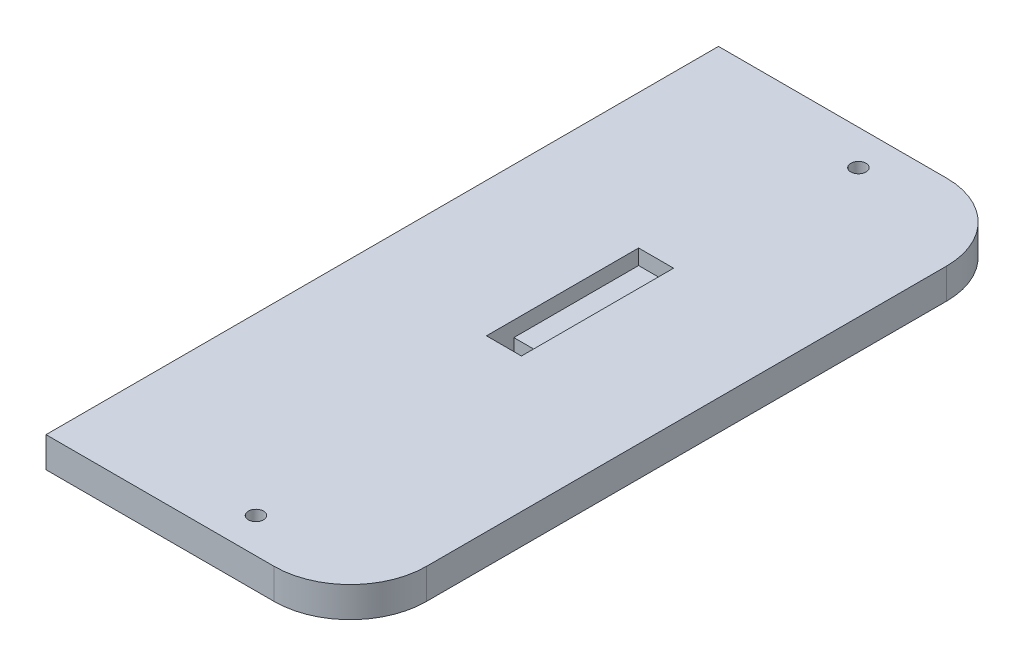
ISO-10303-21;
HEADER;
FILE_DESCRIPTION(('STEP AP214'),'2;1');
FILE_NAME('part.step','',(''),(''),'','','');
FILE_SCHEMA(('AUTOMOTIVE_DESIGN { 1 0 10303 214 1 1 1 1 }'));
ENDSEC;
DATA;
#1=APPLICATION_CONTEXT('core data for automotive mechanical design processes');
#2=APPLICATION_PROTOCOL_DEFINITION('international standard','automotive_design',2000,#1);
#3=PRODUCT_CONTEXT('',#1,'mechanical');
#4=PRODUCT('Part','Part','',(#3));
#5=PRODUCT_RELATED_PRODUCT_CATEGORY('part','',(#4));
#6=PRODUCT_DEFINITION_FORMATION('','',#4);
#7=PRODUCT_DEFINITION_CONTEXT('part definition',#1,'design');
#8=PRODUCT_DEFINITION('design','',#6,#7);
#9=PRODUCT_DEFINITION_SHAPE('','',#8);
#10=(LENGTH_UNIT() NAMED_UNIT(*) SI_UNIT(.MILLI.,.METRE.));
#11=(NAMED_UNIT(*) PLANE_ANGLE_UNIT() SI_UNIT($,.RADIAN.));
#12=(NAMED_UNIT(*) SI_UNIT($,.STERADIAN.) SOLID_ANGLE_UNIT());
#13=UNCERTAINTY_MEASURE_WITH_UNIT(LENGTH_MEASURE(1.E-05),#10,'distance_accuracy_value','');
#14=(GEOMETRIC_REPRESENTATION_CONTEXT(3) GLOBAL_UNCERTAINTY_ASSIGNED_CONTEXT((#13)) GLOBAL_UNIT_ASSIGNED_CONTEXT((#10,
#11,#12)) REPRESENTATION_CONTEXT('',''));
#15=CARTESIAN_POINT('',(0.,0.,0.));
#16=DIRECTION('',(0.,0.,1.));
#17=DIRECTION('',(1.,0.,0.));
#18=AXIS2_PLACEMENT_3D('',#15,#16,#17);
#19=CARTESIAN_POINT('',(0.,2.,0.));
#20=DIRECTION('',(0.,-1.,0.));
#21=DIRECTION('',(0.,0.,-1.));
#22=AXIS2_PLACEMENT_3D('',#19,#20,#21);
#23=PLANE('',#22);
#24=DIRECTION('',(-1.,0.,0.));
#25=VECTOR('',#24,1.);
#26=CARTESIAN_POINT('',(17.7,2.,-43.8));
#27=LINE('',#26,#25);
#28=CARTESIAN_POINT('',(22.3,2.,-43.8));
#29=VERTEX_POINT('',#28);
#30=CARTESIAN_POINT('',(17.7,2.,-43.8));
#31=VERTEX_POINT('',#30);
#32=EDGE_CURVE('E139',#29,#31,#27,.T.);
#33=ORIENTED_EDGE('',*,*,#32,.F.);
#34=DIRECTION('',(0.,0.,1.));
#35=VECTOR('',#34,1.);
#36=CARTESIAN_POINT('',(22.3,2.,-40.2));
#37=LINE('',#36,#35);
#38=CARTESIAN_POINT('',(22.3,2.,-60.2));
#39=VERTEX_POINT('',#38);
#40=EDGE_CURVE('E152',#39,#29,#37,.T.);
#41=ORIENTED_EDGE('',*,*,#40,.F.);
#42=DIRECTION('',(1.,0.,0.));
#43=VECTOR('',#42,1.);
#44=CARTESIAN_POINT('',(17.7,2.,-60.2));
#45=LINE('',#44,#43);
#46=CARTESIAN_POINT('',(17.7,2.,-60.2));
#47=VERTEX_POINT('',#46);
#48=EDGE_CURVE('E148',#47,#39,#45,.T.);
#49=ORIENTED_EDGE('',*,*,#48,.F.);
#50=DIRECTION('',(0.,0.,-1.));
#51=VECTOR('',#50,1.);
#52=CARTESIAN_POINT('',(17.7,2.,-40.2));
#53=LINE('',#52,#51);
#54=EDGE_CURVE('E133',#31,#47,#53,.T.);
#55=ORIENTED_EDGE('',*,*,#54,.F.);
#56=EDGE_LOOP('',(#33,#41,#49,#55));
#57=FACE_BOUND('',#56,.T.);
#58=ADVANCED_FACE('F39',(#57),#23,.F.);
#59=CARTESIAN_POINT('',(23.,10.,-83.8));
#60=DIRECTION('',(0.,-1.,0.));
#61=DIRECTION('',(0.,0.,-1.));
#62=AXIS2_PLACEMENT_3D('',#59,#60,#61);
#63=CYLINDRICAL_SURFACE('',#62,1.);
#64=CARTESIAN_POINT('',(23.,4.,-83.8));
#65=DIRECTION('',(0.,-1.,0.));
#66=DIRECTION('',(0.,0.,-1.));
#67=AXIS2_PLACEMENT_3D('',#64,#65,#66);
#68=CIRCLE('',#67,1.);
#69=CARTESIAN_POINT('',(23.,4.,-84.8));
#70=VERTEX_POINT('',#69);
#71=EDGE_CURVE('E186',#70,#70,#68,.T.);
#72=ORIENTED_EDGE('',*,*,#71,.F.);
#73=EDGE_LOOP('',(#72));
#74=FACE_BOUND('',#73,.T.);
#75=CARTESIAN_POINT('',(23.,2.5,-83.8));
#76=DIRECTION('',(0.,-1.,0.));
#77=DIRECTION('',(0.,0.,-1.));
#78=AXIS2_PLACEMENT_3D('',#75,#76,#77);
#79=CIRCLE('',#78,1.);
#80=CARTESIAN_POINT('',(23.,2.5,-84.8));
#81=VERTEX_POINT('',#80);
#82=EDGE_CURVE('E191',#81,#81,#79,.F.);
#83=ORIENTED_EDGE('',*,*,#82,.F.);
#84=EDGE_LOOP('',(#83));
#85=FACE_BOUND('',#84,.T.);
#86=ADVANCED_FACE('F313',(#74,#85),#63,.F.);
#87=CARTESIAN_POINT('',(23.,10.,-4.6));
#88=DIRECTION('',(0.,-1.,0.));
#89=DIRECTION('',(0.,0.,-1.));
#90=AXIS2_PLACEMENT_3D('',#87,#88,#89);
#91=CYLINDRICAL_SURFACE('',#90,1.);
#92=CARTESIAN_POINT('',(23.,4.,-4.6));
#93=DIRECTION('',(0.,-1.,0.));
#94=DIRECTION('',(0.,0.,-1.));
#95=AXIS2_PLACEMENT_3D('',#92,#93,#94);
#96=CIRCLE('',#95,1.);
#97=CARTESIAN_POINT('',(23.,4.,-5.6));
#98=VERTEX_POINT('',#97);
#99=EDGE_CURVE('E190',#98,#98,#96,.T.);
#100=ORIENTED_EDGE('',*,*,#99,.F.);
#101=EDGE_LOOP('',(#100));
#102=FACE_BOUND('',#101,.T.);
#103=CARTESIAN_POINT('',(23.,2.5,-4.6));
#104=DIRECTION('',(0.,-1.,0.));
#105=DIRECTION('',(0.,0.,-1.));
#106=AXIS2_PLACEMENT_3D('',#103,#104,#105);
#107=CIRCLE('',#106,1.);
#108=CARTESIAN_POINT('',(23.,2.5,-5.6));
#109=VERTEX_POINT('',#108);
#110=EDGE_CURVE('E174',#109,#109,#107,.F.);
#111=ORIENTED_EDGE('',*,*,#110,.F.);
#112=EDGE_LOOP('',(#111));
#113=FACE_BOUND('',#112,.T.);
#114=ADVANCED_FACE('F318',(#102,#113),#91,.F.);
#115=CARTESIAN_POINT('',(0.,4.,0.));
#116=DIRECTION('',(1.,0.,0.));
#117=DIRECTION('',(0.,0.,-1.));
#118=AXIS2_PLACEMENT_3D('',#115,#116,#117);
#119=PLANE('',#118);
#120=DIRECTION('',(0.,0.,1.));
#121=VECTOR('',#120,1.);
#122=CARTESIAN_POINT('',(0.,0.,0.));
#123=LINE('',#122,#121);
#124=CARTESIAN_POINT('',(0.,0.,-88.4));
#125=VERTEX_POINT('',#124);
#126=CARTESIAN_POINT('',(0.,0.,0.));
#127=VERTEX_POINT('',#126);
#128=EDGE_CURVE('E195',#125,#127,#123,.T.);
#129=ORIENTED_EDGE('',*,*,#128,.T.);
#130=DIRECTION('',(0.,-1.,0.));
#131=VECTOR('',#130,1.);
#132=CARTESIAN_POINT('',(0.,4.,0.));
#133=LINE('',#132,#131);
#134=CARTESIAN_POINT('',(0.,4.,0.));
#135=VERTEX_POINT('',#134);
#136=EDGE_CURVE('E229',#135,#127,#133,.T.);
#137=ORIENTED_EDGE('',*,*,#136,.F.);
#138=DIRECTION('',(0.,0.,1.));
#139=VECTOR('',#138,1.);
#140=CARTESIAN_POINT('',(0.,4.,0.));
#141=LINE('',#140,#139);
#142=CARTESIAN_POINT('',(0.,4.,-88.4));
#143=VERTEX_POINT('',#142);
#144=EDGE_CURVE('E196',#143,#135,#141,.T.);
#145=ORIENTED_EDGE('',*,*,#144,.F.);
#146=DIRECTION('',(0.,-1.,0.));
#147=VECTOR('',#146,1.);
#148=CARTESIAN_POINT('',(0.,4.,-88.4));
#149=LINE('',#148,#147);
#150=EDGE_CURVE('E212',#143,#125,#149,.T.);
#151=ORIENTED_EDGE('',*,*,#150,.T.);
#152=EDGE_LOOP('',(#129,#137,#145,#151));
#153=FACE_BOUND('',#152,.T.);
#154=ADVANCED_FACE('F346',(#153),#119,.F.);
#155=CARTESIAN_POINT('',(0.,4.,0.));
#156=DIRECTION('',(0.,0.,-1.));
#157=DIRECTION('',(-1.,0.,0.));
#158=AXIS2_PLACEMENT_3D('',#155,#156,#157);
#159=PLANE('',#158);
#160=DIRECTION('',(1.,0.,0.));
#161=VECTOR('',#160,1.);
#162=CARTESIAN_POINT('',(0.,0.,0.));
#163=LINE('',#162,#161);
#164=CARTESIAN_POINT('',(30.,0.,0.));
#165=VERTEX_POINT('',#164);
#166=EDGE_CURVE('E216',#127,#165,#163,.T.);
#167=ORIENTED_EDGE('',*,*,#166,.T.);
#168=DIRECTION('',(0.,-1.,0.));
#169=VECTOR('',#168,1.);
#170=CARTESIAN_POINT('',(30.,4.,0.));
#171=LINE('',#170,#169);
#172=CARTESIAN_POINT('',(30.,4.,0.));
#173=VERTEX_POINT('',#172);
#174=EDGE_CURVE('E256',#165,#173,#171,.F.);
#175=ORIENTED_EDGE('',*,*,#174,.T.);
#176=DIRECTION('',(1.,0.,0.));
#177=VECTOR('',#176,1.);
#178=CARTESIAN_POINT('',(0.,4.,0.));
#179=LINE('',#178,#177);
#180=EDGE_CURVE('E200',#135,#173,#179,.T.);
#181=ORIENTED_EDGE('',*,*,#180,.F.);
#182=ORIENTED_EDGE('',*,*,#136,.T.);
#183=EDGE_LOOP('',(#167,#175,#181,#182));
#184=FACE_BOUND('',#183,.T.);
#185=ADVANCED_FACE('F361',(#184),#159,.F.);
#186=CARTESIAN_POINT('',(40.,4.,0.));
#187=DIRECTION('',(-1.,0.,0.));
#188=DIRECTION('',(0.,0.,1.));
#189=AXIS2_PLACEMENT_3D('',#186,#187,#188);
#190=PLANE('',#189);
#191=DIRECTION('',(0.,0.,-1.));
#192=VECTOR('',#191,1.);
#193=CARTESIAN_POINT('',(40.,0.,0.));
#194=LINE('',#193,#192);
#195=CARTESIAN_POINT('',(40.,0.,-10.));
#196=VERTEX_POINT('',#195);
#197=CARTESIAN_POINT('',(40.,0.,-78.4));
#198=VERTEX_POINT('',#197);
#199=EDGE_CURVE('E220',#196,#198,#194,.T.);
#200=ORIENTED_EDGE('',*,*,#199,.T.);
#201=DIRECTION('',(0.,-1.,0.));
#202=VECTOR('',#201,1.);
#203=CARTESIAN_POINT('',(40.,4.,-78.4));
#204=LINE('',#203,#202);
#205=CARTESIAN_POINT('',(40.,4.,-78.4));
#206=VERTEX_POINT('',#205);
#207=EDGE_CURVE('E247',#198,#206,#204,.F.);
#208=ORIENTED_EDGE('',*,*,#207,.T.);
#209=DIRECTION('',(0.,0.,-1.));
#210=VECTOR('',#209,1.);
#211=CARTESIAN_POINT('',(40.,4.,0.));
#212=LINE('',#211,#210);
#213=CARTESIAN_POINT('',(40.,4.,-10.));
#214=VERTEX_POINT('',#213);
#215=EDGE_CURVE('E205',#214,#206,#212,.T.);
#216=ORIENTED_EDGE('',*,*,#215,.F.);
#217=DIRECTION('',(0.,-1.,0.));
#218=VECTOR('',#217,1.);
#219=CARTESIAN_POINT('',(40.,4.,-10.));
#220=LINE('',#219,#218);
#221=EDGE_CURVE('E243',#214,#196,#220,.T.);
#222=ORIENTED_EDGE('',*,*,#221,.T.);
#223=EDGE_LOOP('',(#200,#208,#216,#222));
#224=FACE_BOUND('',#223,.T.);
#225=ADVANCED_FACE('F357',(#224),#190,.F.);
#226=CARTESIAN_POINT('',(0.,4.,-88.4));
#227=DIRECTION('',(0.,0.,1.));
#228=DIRECTION('',(1.,0.,0.));
#229=AXIS2_PLACEMENT_3D('',#226,#227,#228);
#230=PLANE('',#229);
#231=DIRECTION('',(-1.,0.,0.));
#232=VECTOR('',#231,1.);
#233=CARTESIAN_POINT('',(0.,4.,-88.4));
#234=LINE('',#233,#232);
#235=CARTESIAN_POINT('',(30.,4.,-88.4));
#236=VERTEX_POINT('',#235);
#237=EDGE_CURVE('E209',#236,#143,#234,.T.);
#238=ORIENTED_EDGE('',*,*,#237,.F.);
#239=DIRECTION('',(0.,-1.,0.));
#240=VECTOR('',#239,1.);
#241=CARTESIAN_POINT('',(30.,4.,-88.4));
#242=LINE('',#241,#240);
#243=CARTESIAN_POINT('',(30.,0.,-88.4));
#244=VERTEX_POINT('',#243);
#245=EDGE_CURVE('E233',#236,#244,#242,.T.);
#246=ORIENTED_EDGE('',*,*,#245,.T.);
#247=DIRECTION('',(-1.,0.,0.));
#248=VECTOR('',#247,1.);
#249=CARTESIAN_POINT('',(0.,0.,-88.4));
#250=LINE('',#249,#248);
#251=EDGE_CURVE('E201',#244,#125,#250,.T.);
#252=ORIENTED_EDGE('',*,*,#251,.T.);
#253=ORIENTED_EDGE('',*,*,#150,.F.);
#254=EDGE_LOOP('',(#238,#246,#252,#253));
#255=FACE_BOUND('',#254,.T.);
#256=ADVANCED_FACE('F351',(#255),#230,.F.);
#257=CARTESIAN_POINT('',(0.,4.,0.));
#258=DIRECTION('',(0.,-1.,0.));
#259=DIRECTION('',(0.,0.,-1.));
#260=AXIS2_PLACEMENT_3D('',#257,#258,#259);
#261=PLANE('',#260);
#262=DIRECTION('',(-1.,0.,0.));
#263=VECTOR('',#262,1.);
#264=CARTESIAN_POINT('',(0.,4.,-40.2));
#265=LINE('',#264,#263);
#266=CARTESIAN_POINT('',(22.3,4.,-40.2));
#267=VERTEX_POINT('',#266);
#268=CARTESIAN_POINT('',(17.7,4.,-40.2));
#269=VERTEX_POINT('',#268);
#270=EDGE_CURVE('E273',#267,#269,#265,.T.);
#271=ORIENTED_EDGE('',*,*,#270,.T.);
#272=DIRECTION('',(0.,0.,-1.));
#273=VECTOR('',#272,1.);
#274=CARTESIAN_POINT('',(17.7,4.,0.));
#275=LINE('',#274,#273);
#276=CARTESIAN_POINT('',(17.7,4.,-60.2));
#277=VERTEX_POINT('',#276);
#278=EDGE_CURVE('E277',#269,#277,#275,.T.);
#279=ORIENTED_EDGE('',*,*,#278,.T.);
#280=DIRECTION('',(1.,0.,0.));
#281=VECTOR('',#280,1.);
#282=CARTESIAN_POINT('',(0.,4.,-60.2));
#283=LINE('',#282,#281);
#284=CARTESIAN_POINT('',(22.3,4.,-60.2));
#285=VERTEX_POINT('',#284);
#286=EDGE_CURVE('E259',#277,#285,#283,.T.);
#287=ORIENTED_EDGE('',*,*,#286,.T.);
#288=DIRECTION('',(0.,0.,1.));
#289=VECTOR('',#288,1.);
#290=CARTESIAN_POINT('',(22.3,4.,0.));
#291=LINE('',#290,#289);
#292=EDGE_CURVE('E269',#285,#267,#291,.T.);
#293=ORIENTED_EDGE('',*,*,#292,.T.);
#294=EDGE_LOOP('',(#271,#279,#287,#293));
#295=FACE_BOUND('',#294,.T.);
#296=ORIENTED_EDGE('',*,*,#99,.T.);
#297=EDGE_LOOP('',(#296));
#298=FACE_BOUND('',#297,.T.);
#299=ORIENTED_EDGE('',*,*,#71,.T.);
#300=EDGE_LOOP('',(#299));
#301=FACE_BOUND('',#300,.T.);
#302=ORIENTED_EDGE('',*,*,#215,.T.);
#303=CARTESIAN_POINT('',(30.,4.,-78.4));
#304=DIRECTION('',(0.,-1.,0.));
#305=DIRECTION('',(0.,0.,-1.));
#306=AXIS2_PLACEMENT_3D('',#303,#304,#305);
#307=CIRCLE('',#306,10.);
#308=EDGE_CURVE('E253',#206,#236,#307,.F.);
#309=ORIENTED_EDGE('',*,*,#308,.T.);
#310=ORIENTED_EDGE('',*,*,#237,.T.);
#311=ORIENTED_EDGE('',*,*,#144,.T.);
#312=ORIENTED_EDGE('',*,*,#180,.T.);
#313=CARTESIAN_POINT('',(30.,4.,-10.));
#314=DIRECTION('',(0.,-1.,0.));
#315=DIRECTION('',(0.,0.,-1.));
#316=AXIS2_PLACEMENT_3D('',#313,#314,#315);
#317=CIRCLE('',#316,10.);
#318=EDGE_CURVE('E250',#173,#214,#317,.F.);
#319=ORIENTED_EDGE('',*,*,#318,.T.);
#320=EDGE_LOOP('',(#302,#309,#310,#311,#312,#319));
#321=FACE_BOUND('',#320,.T.);
#322=ADVANCED_FACE('F298',(#295,#298,#301,#321),#261,.F.);
#323=CARTESIAN_POINT('',(0.,0.,0.));
#324=DIRECTION('',(0.,-1.,0.));
#325=DIRECTION('',(0.,0.,-1.));
#326=AXIS2_PLACEMENT_3D('',#323,#324,#325);
#327=PLANE('',#326);
#328=DIRECTION('',(0.,0.,-1.));
#329=VECTOR('',#328,1.);
#330=CARTESIAN_POINT('',(17.7,0.,0.));
#331=LINE('',#330,#329);
#332=CARTESIAN_POINT('',(17.7,0.,-40.2));
#333=VERTEX_POINT('',#332);
#334=CARTESIAN_POINT('',(17.7,0.,-43.8));
#335=VERTEX_POINT('',#334);
#336=EDGE_CURVE('E11',#333,#335,#331,.T.);
#337=ORIENTED_EDGE('',*,*,#336,.F.);
#338=DIRECTION('',(-1.,0.,0.));
#339=VECTOR('',#338,1.);
#340=CARTESIAN_POINT('',(0.,0.,-40.2));
#341=LINE('',#340,#339);
#342=CARTESIAN_POINT('',(22.3,0.,-40.2));
#343=VERTEX_POINT('',#342);
#344=EDGE_CURVE('E281',#343,#333,#341,.T.);
#345=ORIENTED_EDGE('',*,*,#344,.F.);
#346=DIRECTION('',(0.,0.,1.));
#347=VECTOR('',#346,1.);
#348=CARTESIAN_POINT('',(22.3,0.,0.));
#349=LINE('',#348,#347);
#350=CARTESIAN_POINT('',(22.3,0.,-43.8));
#351=VERTEX_POINT('',#350);
#352=EDGE_CURVE('E284',#351,#343,#349,.T.);
#353=ORIENTED_EDGE('',*,*,#352,.F.);
#354=DIRECTION('',(1.,0.,0.));
#355=VECTOR('',#354,1.);
#356=CARTESIAN_POINT('',(0.,0.,-43.8));
#357=LINE('',#356,#355);
#358=EDGE_CURVE('E48',#335,#351,#357,.T.);
#359=ORIENTED_EDGE('',*,*,#358,.F.);
#360=EDGE_LOOP('',(#337,#345,#353,#359));
#361=FACE_BOUND('',#360,.T.);
#362=CARTESIAN_POINT('',(23.,0.,-4.6));
#363=DIRECTION('',(0.,-1.,0.));
#364=DIRECTION('',(0.,0.,-1.));
#365=AXIS2_PLACEMENT_3D('',#362,#363,#364);
#366=CIRCLE('',#365,1.6);
#367=CARTESIAN_POINT('',(23.,0.,-6.2));
#368=VERTEX_POINT('',#367);
#369=EDGE_CURVE('E175',#368,#368,#366,.T.);
#370=ORIENTED_EDGE('',*,*,#369,.F.);
#371=EDGE_LOOP('',(#370));
#372=FACE_BOUND('',#371,.T.);
#373=CARTESIAN_POINT('',(23.,0.,-83.8));
#374=DIRECTION('',(0.,-1.,0.));
#375=DIRECTION('',(0.,0.,-1.));
#376=AXIS2_PLACEMENT_3D('',#373,#374,#375);
#377=CIRCLE('',#376,1.6);
#378=CARTESIAN_POINT('',(23.,0.,-85.4));
#379=VERTEX_POINT('',#378);
#380=EDGE_CURVE('E162',#379,#379,#377,.T.);
#381=ORIENTED_EDGE('',*,*,#380,.F.);
#382=EDGE_LOOP('',(#381));
#383=FACE_BOUND('',#382,.T.);
#384=ORIENTED_EDGE('',*,*,#251,.F.);
#385=CARTESIAN_POINT('',(30.,0.,-78.4));
#386=DIRECTION('',(0.,-1.,0.));
#387=DIRECTION('',(0.,0.,-1.));
#388=AXIS2_PLACEMENT_3D('',#385,#386,#387);
#389=CIRCLE('',#388,10.);
#390=EDGE_CURVE('E240',#244,#198,#389,.T.);
#391=ORIENTED_EDGE('',*,*,#390,.T.);
#392=ORIENTED_EDGE('',*,*,#199,.F.);
#393=CARTESIAN_POINT('',(30.,0.,-10.));
#394=DIRECTION('',(0.,-1.,0.));
#395=DIRECTION('',(0.,0.,-1.));
#396=AXIS2_PLACEMENT_3D('',#393,#394,#395);
#397=CIRCLE('',#396,10.);
#398=EDGE_CURVE('E237',#196,#165,#397,.T.);
#399=ORIENTED_EDGE('',*,*,#398,.T.);
#400=ORIENTED_EDGE('',*,*,#166,.F.);
#401=ORIENTED_EDGE('',*,*,#128,.F.);
#402=EDGE_LOOP('',(#384,#391,#392,#399,#400,#401));
#403=FACE_BOUND('',#402,.T.);
#404=ADVANCED_FACE('F293',(#361,#372,#383,#403),#327,.T.);
#405=CARTESIAN_POINT('',(30.,4.,-78.4));
#406=DIRECTION('',(0.,-1.,0.));
#407=DIRECTION('',(0.,0.,-1.));
#408=AXIS2_PLACEMENT_3D('',#405,#406,#407);
#409=CYLINDRICAL_SURFACE('',#408,10.);
#410=ORIENTED_EDGE('',*,*,#308,.F.);
#411=ORIENTED_EDGE('',*,*,#207,.F.);
#412=ORIENTED_EDGE('',*,*,#390,.F.);
#413=ORIENTED_EDGE('',*,*,#245,.F.);
#414=EDGE_LOOP('',(#410,#411,#412,#413));
#415=FACE_BOUND('',#414,.T.);
#416=ADVANCED_FACE('F354',(#415),#409,.T.);
#417=CARTESIAN_POINT('',(30.,4.,-10.));
#418=DIRECTION('',(0.,-1.,0.));
#419=DIRECTION('',(0.,0.,-1.));
#420=AXIS2_PLACEMENT_3D('',#417,#418,#419);
#421=CYLINDRICAL_SURFACE('',#420,10.);
#422=ORIENTED_EDGE('',*,*,#318,.F.);
#423=ORIENTED_EDGE('',*,*,#174,.F.);
#424=ORIENTED_EDGE('',*,*,#398,.F.);
#425=ORIENTED_EDGE('',*,*,#221,.F.);
#426=EDGE_LOOP('',(#422,#423,#424,#425));
#427=FACE_BOUND('',#426,.T.);
#428=ADVANCED_FACE('F41',(#427),#421,.T.);
#429=CARTESIAN_POINT('',(23.,2.5,-4.6));
#430=DIRECTION('',(0.,-1.,0.));
#431=DIRECTION('',(0.,0.,-1.));
#432=AXIS2_PLACEMENT_3D('',#429,#430,#431);
#433=PLANE('',#432);
#434=CARTESIAN_POINT('',(23.,2.5,-4.6));
#435=DIRECTION('',(0.,-1.,0.));
#436=DIRECTION('',(0.,0.,-1.));
#437=AXIS2_PLACEMENT_3D('',#434,#435,#436);
#438=CIRCLE('',#437,1.6);
#439=CARTESIAN_POINT('',(23.,2.5,-6.2));
#440=VERTEX_POINT('',#439);
#441=EDGE_CURVE('E170',#440,#440,#438,.T.);
#442=ORIENTED_EDGE('',*,*,#441,.T.);
#443=EDGE_LOOP('',(#442));
#444=FACE_BOUND('',#443,.T.);
#445=ORIENTED_EDGE('',*,*,#110,.T.);
#446=EDGE_LOOP('',(#445));
#447=FACE_BOUND('',#446,.T.);
#448=ADVANCED_FACE('F334',(#444,#447),#433,.T.);
#449=CARTESIAN_POINT('',(23.,2.5,-4.6));
#450=DIRECTION('',(0.,-1.,0.));
#451=DIRECTION('',(0.,0.,-1.));
#452=AXIS2_PLACEMENT_3D('',#449,#450,#451);
#453=CYLINDRICAL_SURFACE('',#452,1.6);
#454=ORIENTED_EDGE('',*,*,#441,.F.);
#455=EDGE_LOOP('',(#454));
#456=FACE_BOUND('',#455,.T.);
#457=ORIENTED_EDGE('',*,*,#369,.T.);
#458=EDGE_LOOP('',(#457));
#459=FACE_BOUND('',#458,.T.);
#460=ADVANCED_FACE('F337',(#456,#459),#453,.F.);
#461=CARTESIAN_POINT('',(23.,2.5,-83.8));
#462=DIRECTION('',(0.,-1.,0.));
#463=DIRECTION('',(0.,0.,-1.));
#464=AXIS2_PLACEMENT_3D('',#461,#462,#463);
#465=PLANE('',#464);
#466=CARTESIAN_POINT('',(23.,2.5,-83.8));
#467=DIRECTION('',(0.,-1.,0.));
#468=DIRECTION('',(0.,0.,-1.));
#469=AXIS2_PLACEMENT_3D('',#466,#467,#468);
#470=CIRCLE('',#469,1.6);
#471=CARTESIAN_POINT('',(23.,2.5,-85.4));
#472=VERTEX_POINT('',#471);
#473=EDGE_CURVE('E179',#472,#472,#470,.T.);
#474=ORIENTED_EDGE('',*,*,#473,.T.);
#475=EDGE_LOOP('',(#474));
#476=FACE_BOUND('',#475,.T.);
#477=ORIENTED_EDGE('',*,*,#82,.T.);
#478=EDGE_LOOP('',(#477));
#479=FACE_BOUND('',#478,.T.);
#480=ADVANCED_FACE('F330',(#476,#479),#465,.T.);
#481=CARTESIAN_POINT('',(23.,2.5,-83.8));
#482=DIRECTION('',(0.,-1.,0.));
#483=DIRECTION('',(0.,0.,-1.));
#484=AXIS2_PLACEMENT_3D('',#481,#482,#483);
#485=CYLINDRICAL_SURFACE('',#484,1.6);
#486=ORIENTED_EDGE('',*,*,#473,.F.);
#487=EDGE_LOOP('',(#486));
#488=FACE_BOUND('',#487,.T.);
#489=ORIENTED_EDGE('',*,*,#380,.T.);
#490=EDGE_LOOP('',(#489));
#491=FACE_BOUND('',#490,.T.);
#492=ADVANCED_FACE('F326',(#488,#491),#485,.F.);
#493=CARTESIAN_POINT('',(17.7,12.,-40.2));
#494=DIRECTION('',(-1.,0.,0.));
#495=DIRECTION('',(0.,0.,1.));
#496=AXIS2_PLACEMENT_3D('',#493,#494,#495);
#497=PLANE('',#496);
#498=DIRECTION('',(0.,-1.,0.));
#499=VECTOR('',#498,1.);
#500=CARTESIAN_POINT('',(17.7,12.,-40.2));
#501=LINE('',#500,#499);
#502=EDGE_CURVE('E159',#269,#333,#501,.T.);
#503=ORIENTED_EDGE('',*,*,#502,.T.);
#504=ORIENTED_EDGE('',*,*,#336,.T.);
#505=DIRECTION('',(0.,1.,0.));
#506=VECTOR('',#505,1.);
#507=CARTESIAN_POINT('',(17.7,-9.5,-43.8));
#508=LINE('',#507,#506);
#509=EDGE_CURVE('E129',#335,#31,#508,.T.);
#510=ORIENTED_EDGE('',*,*,#509,.T.);
#511=ORIENTED_EDGE('',*,*,#54,.T.);
#512=DIRECTION('',(0.,-1.,0.));
#513=VECTOR('',#512,1.);
#514=CARTESIAN_POINT('',(17.7,12.,-60.2));
#515=LINE('',#514,#513);
#516=EDGE_CURVE('E158',#277,#47,#515,.T.);
#517=ORIENTED_EDGE('',*,*,#516,.F.);
#518=ORIENTED_EDGE('',*,*,#278,.F.);
#519=EDGE_LOOP('',(#503,#504,#510,#511,#517,#518));
#520=FACE_BOUND('',#519,.T.);
#521=ADVANCED_FACE('F130',(#520),#497,.F.);
#522=CARTESIAN_POINT('',(17.7,12.,-40.2));
#523=DIRECTION('',(0.,0.,1.));
#524=DIRECTION('',(1.,0.,0.));
#525=AXIS2_PLACEMENT_3D('',#522,#523,#524);
#526=PLANE('',#525);
#527=DIRECTION('',(0.,-1.,0.));
#528=VECTOR('',#527,1.);
#529=CARTESIAN_POINT('',(22.3,12.,-40.2));
#530=LINE('',#529,#528);
#531=EDGE_CURVE('E63',#267,#343,#530,.T.);
#532=ORIENTED_EDGE('',*,*,#531,.T.);
#533=ORIENTED_EDGE('',*,*,#344,.T.);
#534=ORIENTED_EDGE('',*,*,#502,.F.);
#535=ORIENTED_EDGE('',*,*,#270,.F.);
#536=EDGE_LOOP('',(#532,#533,#534,#535));
#537=FACE_BOUND('',#536,.T.);
#538=ADVANCED_FACE('F296',(#537),#526,.F.);
#539=CARTESIAN_POINT('',(22.3,12.,-40.2));
#540=DIRECTION('',(1.,0.,0.));
#541=DIRECTION('',(0.,0.,-1.));
#542=AXIS2_PLACEMENT_3D('',#539,#540,#541);
#543=PLANE('',#542);
#544=DIRECTION('',(0.,-1.,0.));
#545=VECTOR('',#544,1.);
#546=CARTESIAN_POINT('',(22.3,12.,-60.2));
#547=LINE('',#546,#545);
#548=EDGE_CURVE('E165',#285,#39,#547,.T.);
#549=ORIENTED_EDGE('',*,*,#548,.T.);
#550=ORIENTED_EDGE('',*,*,#40,.T.);
#551=DIRECTION('',(0.,1.,0.));
#552=VECTOR('',#551,1.);
#553=CARTESIAN_POINT('',(22.3,-9.5,-43.8));
#554=LINE('',#553,#552);
#555=EDGE_CURVE('E55',#351,#29,#554,.T.);
#556=ORIENTED_EDGE('',*,*,#555,.F.);
#557=ORIENTED_EDGE('',*,*,#352,.T.);
#558=ORIENTED_EDGE('',*,*,#531,.F.);
#559=ORIENTED_EDGE('',*,*,#292,.F.);
#560=EDGE_LOOP('',(#549,#550,#556,#557,#558,#559));
#561=FACE_BOUND('',#560,.T.);
#562=ADVANCED_FACE('F290',(#561),#543,.F.);
#563=CARTESIAN_POINT('',(17.7,12.,-60.2));
#564=DIRECTION('',(0.,0.,-1.));
#565=DIRECTION('',(-1.,0.,0.));
#566=AXIS2_PLACEMENT_3D('',#563,#564,#565);
#567=PLANE('',#566);
#568=ORIENTED_EDGE('',*,*,#516,.T.);
#569=ORIENTED_EDGE('',*,*,#48,.T.);
#570=ORIENTED_EDGE('',*,*,#548,.F.);
#571=ORIENTED_EDGE('',*,*,#286,.F.);
#572=EDGE_LOOP('',(#568,#569,#570,#571));
#573=FACE_BOUND('',#572,.T.);
#574=ADVANCED_FACE('F302',(#573),#567,.F.);
#575=CARTESIAN_POINT('',(17.7,-9.5,-43.8));
#576=DIRECTION('',(0.,0.,-1.));
#577=DIRECTION('',(-1.,0.,0.));
#578=AXIS2_PLACEMENT_3D('',#575,#576,#577);
#579=PLANE('',#578);
#580=ORIENTED_EDGE('',*,*,#358,.T.);
#581=ORIENTED_EDGE('',*,*,#555,.T.);
#582=ORIENTED_EDGE('',*,*,#32,.T.);
#583=ORIENTED_EDGE('',*,*,#509,.F.);
#584=EDGE_LOOP('',(#580,#581,#582,#583));
#585=FACE_BOUND('',#584,.T.);
#586=ADVANCED_FACE('F140',(#585),#579,.F.);
#587=CLOSED_SHELL('',(#58,#86,#114,#154,#185,#225,#256,#322,#404,#416,#428,#448,#460,#480,#492,
#521,#538,#562,#574,#586));
#588=MANIFOLD_SOLID_BREP('B2',#587);
#589=ADVANCED_BREP_SHAPE_REPRESENTATION('',(#18,#588),#14);
#590=SHAPE_DEFINITION_REPRESENTATION(#9,#589);
ENDSEC;
END-ISO-10303-21;
